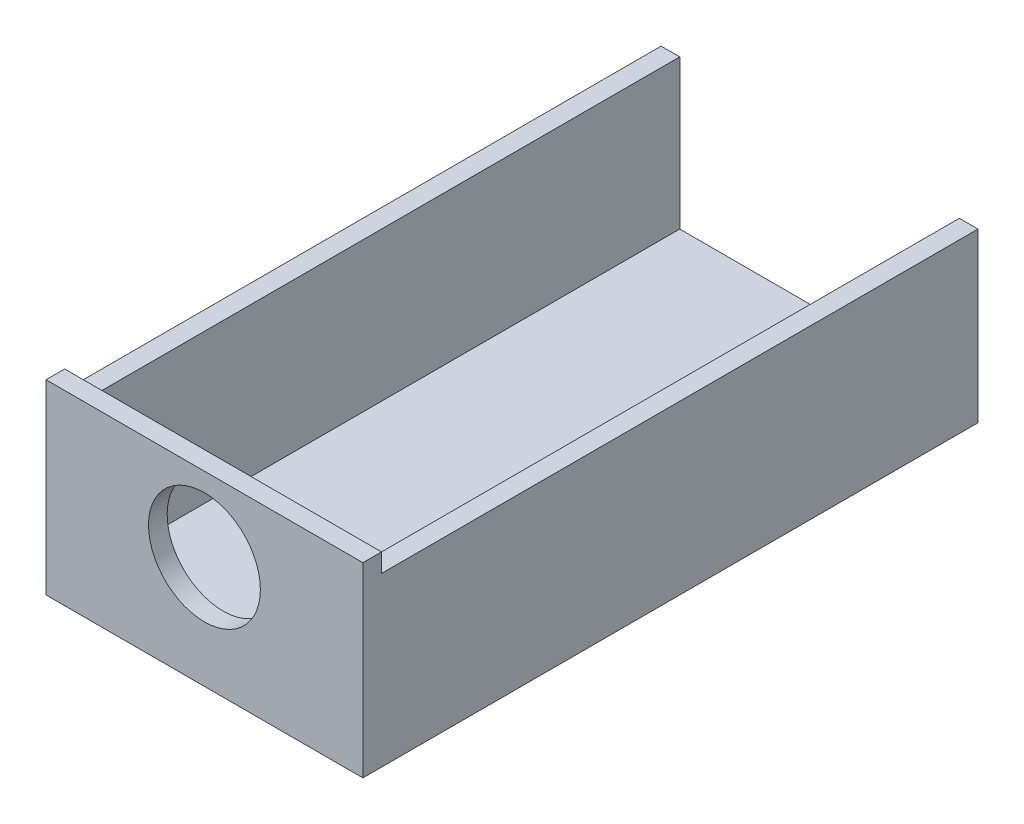
ISO-10303-21;
HEADER;
FILE_DESCRIPTION(('STEP AP214'),'2;1');
FILE_NAME('part.step','',(''),(''),'','','');
FILE_SCHEMA(('AUTOMOTIVE_DESIGN { 1 0 10303 214 1 1 1 1 }'));
ENDSEC;
DATA;
#1=APPLICATION_CONTEXT('core data for automotive mechanical design processes');
#2=APPLICATION_PROTOCOL_DEFINITION('international standard','automotive_design',2000,#1);
#3=PRODUCT_CONTEXT('',#1,'mechanical');
#4=PRODUCT('Part','Part','',(#3));
#5=PRODUCT_RELATED_PRODUCT_CATEGORY('part','',(#4));
#6=PRODUCT_DEFINITION_FORMATION('','',#4);
#7=PRODUCT_DEFINITION_CONTEXT('part definition',#1,'design');
#8=PRODUCT_DEFINITION('design','',#6,#7);
#9=PRODUCT_DEFINITION_SHAPE('','',#8);
#10=(LENGTH_UNIT() NAMED_UNIT(*) SI_UNIT(.MILLI.,.METRE.));
#11=(NAMED_UNIT(*) PLANE_ANGLE_UNIT() SI_UNIT($,.RADIAN.));
#12=(NAMED_UNIT(*) SI_UNIT($,.STERADIAN.) SOLID_ANGLE_UNIT());
#13=UNCERTAINTY_MEASURE_WITH_UNIT(LENGTH_MEASURE(1.E-05),#10,'distance_accuracy_value','');
#14=(GEOMETRIC_REPRESENTATION_CONTEXT(3) GLOBAL_UNCERTAINTY_ASSIGNED_CONTEXT((#13)) GLOBAL_UNIT_ASSIGNED_CONTEXT((#10,
#11,#12)) REPRESENTATION_CONTEXT('',''));
#15=CARTESIAN_POINT('',(0.,0.,0.));
#16=DIRECTION('',(0.,0.,1.));
#17=DIRECTION('',(1.,0.,0.));
#18=AXIS2_PLACEMENT_3D('',#15,#16,#17);
#19=CARTESIAN_POINT('',(-8.49999999999999,10.,16.5));
#20=DIRECTION('',(1.,0.,0.));
#21=DIRECTION('',(0.,0.,-1.));
#22=AXIS2_PLACEMENT_3D('',#19,#20,#21);
#23=PLANE('',#22);
#24=DIRECTION('',(0.,-1.,0.));
#25=VECTOR('',#24,1.);
#26=CARTESIAN_POINT('',(-8.49999999999999,17.,15.5));
#27=LINE('',#26,#25);
#28=CARTESIAN_POINT('',(-8.49999999999999,10.,15.5));
#29=VERTEX_POINT('',#28);
#30=CARTESIAN_POINT('',(-8.49999999999999,9.,15.5));
#31=VERTEX_POINT('',#30);
#32=EDGE_CURVE('E124',#29,#31,#27,.T.);
#33=ORIENTED_EDGE('',*,*,#32,.T.);
#34=DIRECTION('',(0.,0.,1.));
#35=VECTOR('',#34,1.);
#36=CARTESIAN_POINT('',(-8.49999999999999,9.,-16.5));
#37=LINE('',#36,#35);
#38=CARTESIAN_POINT('',(-8.49999999999999,9.,-16.5));
#39=VERTEX_POINT('',#38);
#40=EDGE_CURVE('E83',#39,#31,#37,.T.);
#41=ORIENTED_EDGE('',*,*,#40,.F.);
#42=DIRECTION('',(0.,-1.,0.));
#43=VECTOR('',#42,1.);
#44=CARTESIAN_POINT('',(-8.49999999999999,10.,-16.5));
#45=LINE('',#44,#43);
#46=CARTESIAN_POINT('',(-8.49999999999999,0.,-16.5));
#47=VERTEX_POINT('',#46);
#48=EDGE_CURVE('E75',#39,#47,#45,.T.);
#49=ORIENTED_EDGE('',*,*,#48,.T.);
#50=DIRECTION('',(0.,0.,1.));
#51=VECTOR('',#50,1.);
#52=CARTESIAN_POINT('',(-8.49999999999999,0.,16.5));
#53=LINE('',#52,#51);
#54=CARTESIAN_POINT('',(-8.49999999999999,0.,16.5));
#55=VERTEX_POINT('',#54);
#56=EDGE_CURVE('E80',#47,#55,#53,.T.);
#57=ORIENTED_EDGE('',*,*,#56,.T.);
#58=DIRECTION('',(0.,-1.,0.));
#59=VECTOR('',#58,1.);
#60=CARTESIAN_POINT('',(-8.49999999999999,10.,16.5));
#61=LINE('',#60,#59);
#62=CARTESIAN_POINT('',(-8.49999999999999,10.,16.5));
#63=VERTEX_POINT('',#62);
#64=EDGE_CURVE('E11',#63,#55,#61,.T.);
#65=ORIENTED_EDGE('',*,*,#64,.F.);
#66=DIRECTION('',(0.,0.,1.));
#67=VECTOR('',#66,1.);
#68=CARTESIAN_POINT('',(-8.49999999999999,10.,16.5));
#69=LINE('',#68,#67);
#70=EDGE_CURVE('E97',#29,#63,#69,.T.);
#71=ORIENTED_EDGE('',*,*,#70,.F.);
#72=EDGE_LOOP('',(#33,#41,#49,#57,#65,#71));
#73=FACE_BOUND('',#72,.T.);
#74=ADVANCED_FACE('F32',(#73),#23,.F.);
#75=CARTESIAN_POINT('',(8.50000000000001,10.,16.5));
#76=DIRECTION('',(-1.,0.,0.));
#77=DIRECTION('',(0.,0.,1.));
#78=AXIS2_PLACEMENT_3D('',#75,#76,#77);
#79=PLANE('',#78);
#80=DIRECTION('',(0.,-1.,0.));
#81=VECTOR('',#80,1.);
#82=CARTESIAN_POINT('',(8.50000000000001,17.,15.5));
#83=LINE('',#82,#81);
#84=CARTESIAN_POINT('',(8.50000000000001,10.,15.5));
#85=VERTEX_POINT('',#84);
#86=CARTESIAN_POINT('',(8.50000000000001,9.,15.5));
#87=VERTEX_POINT('',#86);
#88=EDGE_CURVE('E162',#85,#87,#83,.T.);
#89=ORIENTED_EDGE('',*,*,#88,.F.);
#90=DIRECTION('',(0.,0.,-1.));
#91=VECTOR('',#90,1.);
#92=CARTESIAN_POINT('',(8.50000000000001,10.,16.5));
#93=LINE('',#92,#91);
#94=CARTESIAN_POINT('',(8.50000000000001,10.,16.5));
#95=VERTEX_POINT('',#94);
#96=EDGE_CURVE('E87',#95,#85,#93,.T.);
#97=ORIENTED_EDGE('',*,*,#96,.F.);
#98=DIRECTION('',(0.,-1.,0.));
#99=VECTOR('',#98,1.);
#100=CARTESIAN_POINT('',(8.50000000000001,10.,16.5));
#101=LINE('',#100,#99);
#102=CARTESIAN_POINT('',(8.50000000000001,0.,16.5));
#103=VERTEX_POINT('',#102);
#104=EDGE_CURVE('E39',#95,#103,#101,.T.);
#105=ORIENTED_EDGE('',*,*,#104,.T.);
#106=DIRECTION('',(0.,0.,-1.));
#107=VECTOR('',#106,1.);
#108=CARTESIAN_POINT('',(8.50000000000001,0.,16.5));
#109=LINE('',#108,#107);
#110=CARTESIAN_POINT('',(8.50000000000001,0.,-16.5));
#111=VERTEX_POINT('',#110);
#112=EDGE_CURVE('E98',#103,#111,#109,.T.);
#113=ORIENTED_EDGE('',*,*,#112,.T.);
#114=DIRECTION('',(0.,-1.,0.));
#115=VECTOR('',#114,1.);
#116=CARTESIAN_POINT('',(8.50000000000001,10.,-16.5));
#117=LINE('',#116,#115);
#118=CARTESIAN_POINT('',(8.50000000000001,9.,-16.5));
#119=VERTEX_POINT('',#118);
#120=EDGE_CURVE('E86',#119,#111,#117,.T.);
#121=ORIENTED_EDGE('',*,*,#120,.F.);
#122=DIRECTION('',(0.,0.,-1.));
#123=VECTOR('',#122,1.);
#124=CARTESIAN_POINT('',(8.50000000000001,9.,-16.5));
#125=LINE('',#124,#123);
#126=EDGE_CURVE('E169',#87,#119,#125,.T.);
#127=ORIENTED_EDGE('',*,*,#126,.F.);
#128=EDGE_LOOP('',(#89,#97,#105,#113,#121,#127));
#129=FACE_BOUND('',#128,.T.);
#130=ADVANCED_FACE('F116',(#129),#79,.F.);
#131=CARTESIAN_POINT('',(8.50000000000001,10.,-16.5));
#132=DIRECTION('',(0.,0.,1.));
#133=DIRECTION('',(1.,0.,0.));
#134=AXIS2_PLACEMENT_3D('',#131,#132,#133);
#135=PLANE('',#134);
#136=DIRECTION('',(-1.,0.,0.));
#137=VECTOR('',#136,1.);
#138=CARTESIAN_POINT('',(-8.49999999999999,9.,-16.5));
#139=LINE('',#138,#137);
#140=CARTESIAN_POINT('',(7.50000000000001,9.,-16.5));
#141=VERTEX_POINT('',#140);
#142=EDGE_CURVE('E165',#119,#141,#139,.T.);
#143=ORIENTED_EDGE('',*,*,#142,.F.);
#144=ORIENTED_EDGE('',*,*,#120,.T.);
#145=DIRECTION('',(-1.,0.,0.));
#146=VECTOR('',#145,1.);
#147=CARTESIAN_POINT('',(8.50000000000001,0.,-16.5));
#148=LINE('',#147,#146);
#149=EDGE_CURVE('E90',#111,#47,#148,.T.);
#150=ORIENTED_EDGE('',*,*,#149,.T.);
#151=ORIENTED_EDGE('',*,*,#48,.F.);
#152=CARTESIAN_POINT('',(-7.5,9.,-16.5));
#153=VERTEX_POINT('',#152);
#154=EDGE_CURVE('E168',#153,#39,#139,.T.);
#155=ORIENTED_EDGE('',*,*,#154,.F.);
#156=DIRECTION('',(0.,-1.,0.));
#157=VECTOR('',#156,1.);
#158=CARTESIAN_POINT('',(-7.5,9.,-16.5));
#159=LINE('',#158,#157);
#160=CARTESIAN_POINT('',(-7.5,1.,-16.5));
#161=VERTEX_POINT('',#160);
#162=EDGE_CURVE('E134',#153,#161,#159,.T.);
#163=ORIENTED_EDGE('',*,*,#162,.T.);
#164=DIRECTION('',(-1.,0.,0.));
#165=VECTOR('',#164,1.);
#166=CARTESIAN_POINT('',(-7.5,1.,-16.5));
#167=LINE('',#166,#165);
#168=CARTESIAN_POINT('',(7.50000000000001,0.999999999999999,-16.5));
#169=VERTEX_POINT('',#168);
#170=EDGE_CURVE('E138',#169,#161,#167,.T.);
#171=ORIENTED_EDGE('',*,*,#170,.F.);
#172=DIRECTION('',(0.,-1.,0.));
#173=VECTOR('',#172,1.);
#174=CARTESIAN_POINT('',(7.50000000000001,9.,-16.5));
#175=LINE('',#174,#173);
#176=EDGE_CURVE('E46',#141,#169,#175,.T.);
#177=ORIENTED_EDGE('',*,*,#176,.F.);
#178=EDGE_LOOP('',(#143,#144,#150,#151,#155,#163,#171,#177));
#179=FACE_BOUND('',#178,.T.);
#180=ADVANCED_FACE('F92',(#179),#135,.F.);
#181=CARTESIAN_POINT('',(0.,10.,0.));
#182=DIRECTION('',(0.,1.,0.));
#183=DIRECTION('',(0.,0.,1.));
#184=AXIS2_PLACEMENT_3D('',#181,#182,#183);
#185=PLANE('',#184);
#186=ORIENTED_EDGE('',*,*,#96,.T.);
#187=DIRECTION('',(-1.,0.,0.));
#188=VECTOR('',#187,1.);
#189=CARTESIAN_POINT('',(0.,10.,15.5));
#190=LINE('',#189,#188);
#191=EDGE_CURVE('E159',#85,#29,#190,.T.);
#192=ORIENTED_EDGE('',*,*,#191,.T.);
#193=ORIENTED_EDGE('',*,*,#70,.T.);
#194=DIRECTION('',(1.,0.,0.));
#195=VECTOR('',#194,1.);
#196=CARTESIAN_POINT('',(8.50000000000001,10.,16.5));
#197=LINE('',#196,#195);
#198=EDGE_CURVE('E55',#63,#95,#197,.T.);
#199=ORIENTED_EDGE('',*,*,#198,.T.);
#200=EDGE_LOOP('',(#186,#192,#193,#199));
#201=FACE_BOUND('',#200,.T.);
#202=ADVANCED_FACE('F237',(#201),#185,.T.);
#203=CARTESIAN_POINT('',(8.50000000000001,10.,16.5));
#204=DIRECTION('',(0.,0.,-1.));
#205=DIRECTION('',(-1.,0.,0.));
#206=AXIS2_PLACEMENT_3D('',#203,#204,#205);
#207=PLANE('',#206);
#208=DIRECTION('',(1.,0.,0.));
#209=VECTOR('',#208,1.);
#210=CARTESIAN_POINT('',(8.50000000000001,0.,16.5));
#211=LINE('',#210,#209);
#212=EDGE_CURVE('E101',#55,#103,#211,.T.);
#213=ORIENTED_EDGE('',*,*,#212,.T.);
#214=ORIENTED_EDGE('',*,*,#104,.F.);
#215=ORIENTED_EDGE('',*,*,#198,.F.);
#216=ORIENTED_EDGE('',*,*,#64,.T.);
#217=EDGE_LOOP('',(#213,#214,#215,#216));
#218=FACE_BOUND('',#217,.T.);
#219=CARTESIAN_POINT('',(0.,6.,16.5));
#220=DIRECTION('',(0.,0.,1.));
#221=DIRECTION('',(1.,0.,0.));
#222=AXIS2_PLACEMENT_3D('',#219,#220,#221);
#223=CIRCLE('',#222,3.);
#224=CARTESIAN_POINT('',(3.,6.,16.5));
#225=VERTEX_POINT('',#224);
#226=EDGE_CURVE('E156',#225,#225,#223,.T.);
#227=ORIENTED_EDGE('',*,*,#226,.F.);
#228=EDGE_LOOP('',(#227));
#229=FACE_BOUND('',#228,.T.);
#230=ADVANCED_FACE('F118',(#218,#229),#207,.F.);
#231=CARTESIAN_POINT('',(-7.49999999999999,9.,15.5));
#232=DIRECTION('',(0.,0.,-1.));
#233=DIRECTION('',(-1.,0.,0.));
#234=AXIS2_PLACEMENT_3D('',#231,#232,#233);
#235=PLANE('',#234);
#236=CARTESIAN_POINT('',(0.,6.,15.5));
#237=DIRECTION('',(0.,0.,-1.));
#238=DIRECTION('',(-1.,0.,0.));
#239=AXIS2_PLACEMENT_3D('',#236,#237,#238);
#240=CIRCLE('',#239,3.);
#241=CARTESIAN_POINT('',(-3.,6.,15.5));
#242=VERTEX_POINT('',#241);
#243=EDGE_CURVE('E150',#242,#242,#240,.F.);
#244=ORIENTED_EDGE('',*,*,#243,.T.);
#245=EDGE_LOOP('',(#244));
#246=FACE_BOUND('',#245,.T.);
#247=DIRECTION('',(0.,-1.,0.));
#248=VECTOR('',#247,1.);
#249=CARTESIAN_POINT('',(-7.49999999999999,9.,15.5));
#250=LINE('',#249,#248);
#251=CARTESIAN_POINT('',(-7.5,9.,15.5));
#252=VERTEX_POINT('',#251);
#253=CARTESIAN_POINT('',(-7.49999999999999,1.,15.5));
#254=VERTEX_POINT('',#253);
#255=EDGE_CURVE('E102',#252,#254,#250,.T.);
#256=ORIENTED_EDGE('',*,*,#255,.F.);
#257=DIRECTION('',(1.,0.,0.));
#258=VECTOR('',#257,1.);
#259=CARTESIAN_POINT('',(-8.49999999999999,9.,15.5));
#260=LINE('',#259,#258);
#261=EDGE_CURVE('E172',#31,#252,#260,.T.);
#262=ORIENTED_EDGE('',*,*,#261,.F.);
#263=ORIENTED_EDGE('',*,*,#32,.F.);
#264=ORIENTED_EDGE('',*,*,#191,.F.);
#265=ORIENTED_EDGE('',*,*,#88,.T.);
#266=CARTESIAN_POINT('',(7.50000000000001,9.,15.5));
#267=VERTEX_POINT('',#266);
#268=EDGE_CURVE('E175',#267,#87,#260,.T.);
#269=ORIENTED_EDGE('',*,*,#268,.F.);
#270=DIRECTION('',(0.,-1.,0.));
#271=VECTOR('',#270,1.);
#272=CARTESIAN_POINT('',(7.50000000000001,9.,15.5));
#273=LINE('',#272,#271);
#274=CARTESIAN_POINT('',(7.50000000000001,1.,15.5));
#275=VERTEX_POINT('',#274);
#276=EDGE_CURVE('E106',#267,#275,#273,.T.);
#277=ORIENTED_EDGE('',*,*,#276,.T.);
#278=DIRECTION('',(1.,0.,0.));
#279=VECTOR('',#278,1.);
#280=CARTESIAN_POINT('',(-7.49999999999999,1.,15.5));
#281=LINE('',#280,#279);
#282=EDGE_CURVE('E144',#254,#275,#281,.T.);
#283=ORIENTED_EDGE('',*,*,#282,.F.);
#284=EDGE_LOOP('',(#256,#262,#263,#264,#265,#269,#277,#283));
#285=FACE_BOUND('',#284,.T.);
#286=ADVANCED_FACE('F217',(#246,#285),#235,.T.);
#287=CARTESIAN_POINT('',(0.,0.,0.));
#288=DIRECTION('',(0.,1.,0.));
#289=DIRECTION('',(0.,0.,1.));
#290=AXIS2_PLACEMENT_3D('',#287,#288,#289);
#291=PLANE('',#290);
#292=ORIENTED_EDGE('',*,*,#56,.F.);
#293=ORIENTED_EDGE('',*,*,#149,.F.);
#294=ORIENTED_EDGE('',*,*,#112,.F.);
#295=ORIENTED_EDGE('',*,*,#212,.F.);
#296=EDGE_LOOP('',(#292,#293,#294,#295));
#297=FACE_BOUND('',#296,.T.);
#298=ADVANCED_FACE('F100',(#297),#291,.F.);
#299=CARTESIAN_POINT('',(-7.5,9.,-16.5));
#300=DIRECTION('',(1.,0.,0.));
#301=DIRECTION('',(0.,0.,-1.));
#302=AXIS2_PLACEMENT_3D('',#299,#300,#301);
#303=PLANE('',#302);
#304=DIRECTION('',(0.,0.,1.));
#305=VECTOR('',#304,1.);
#306=CARTESIAN_POINT('',(-7.5,1.,-16.5));
#307=LINE('',#306,#305);
#308=EDGE_CURVE('E147',#161,#254,#307,.T.);
#309=ORIENTED_EDGE('',*,*,#308,.F.);
#310=ORIENTED_EDGE('',*,*,#162,.F.);
#311=DIRECTION('',(0.,0.,1.));
#312=VECTOR('',#311,1.);
#313=CARTESIAN_POINT('',(-7.5,9.,-16.5));
#314=LINE('',#313,#312);
#315=EDGE_CURVE('E141',#153,#252,#314,.T.);
#316=ORIENTED_EDGE('',*,*,#315,.T.);
#317=ORIENTED_EDGE('',*,*,#255,.T.);
#318=EDGE_LOOP('',(#309,#310,#316,#317));
#319=FACE_BOUND('',#318,.T.);
#320=ADVANCED_FACE('F213',(#319),#303,.T.);
#321=CARTESIAN_POINT('',(7.50000000000001,9.,-16.5));
#322=DIRECTION('',(-1.,0.,0.));
#323=DIRECTION('',(0.,0.,1.));
#324=AXIS2_PLACEMENT_3D('',#321,#322,#323);
#325=PLANE('',#324);
#326=DIRECTION('',(0.,0.,-1.));
#327=VECTOR('',#326,1.);
#328=CARTESIAN_POINT('',(7.50000000000001,1.,-16.5));
#329=LINE('',#328,#327);
#330=EDGE_CURVE('E142',#275,#169,#329,.T.);
#331=ORIENTED_EDGE('',*,*,#330,.F.);
#332=ORIENTED_EDGE('',*,*,#276,.F.);
#333=DIRECTION('',(0.,0.,-1.));
#334=VECTOR('',#333,1.);
#335=CARTESIAN_POINT('',(7.50000000000001,9.,-16.5));
#336=LINE('',#335,#334);
#337=EDGE_CURVE('E137',#267,#141,#336,.T.);
#338=ORIENTED_EDGE('',*,*,#337,.T.);
#339=ORIENTED_EDGE('',*,*,#176,.T.);
#340=EDGE_LOOP('',(#331,#332,#338,#339));
#341=FACE_BOUND('',#340,.T.);
#342=ADVANCED_FACE('F218',(#341),#325,.T.);
#343=CARTESIAN_POINT('',(0.,1.,0.));
#344=DIRECTION('',(0.,1.,0.));
#345=DIRECTION('',(0.,0.,1.));
#346=AXIS2_PLACEMENT_3D('',#343,#344,#345);
#347=PLANE('',#346);
#348=ORIENTED_EDGE('',*,*,#308,.T.);
#349=ORIENTED_EDGE('',*,*,#282,.T.);
#350=ORIENTED_EDGE('',*,*,#330,.T.);
#351=ORIENTED_EDGE('',*,*,#170,.T.);
#352=EDGE_LOOP('',(#348,#349,#350,#351));
#353=FACE_BOUND('',#352,.T.);
#354=ADVANCED_FACE('F210',(#353),#347,.T.);
#355=CARTESIAN_POINT('',(0.,6.,16.5));
#356=DIRECTION('',(0.,0.,-1.));
#357=DIRECTION('',(-1.,0.,0.));
#358=AXIS2_PLACEMENT_3D('',#355,#356,#357);
#359=CYLINDRICAL_SURFACE('',#358,3.);
#360=ORIENTED_EDGE('',*,*,#243,.F.);
#361=EDGE_LOOP('',(#360));
#362=FACE_BOUND('',#361,.T.);
#363=ORIENTED_EDGE('',*,*,#226,.T.);
#364=EDGE_LOOP('',(#363));
#365=FACE_BOUND('',#364,.T.);
#366=ADVANCED_FACE('F225',(#362,#365),#359,.F.);
#367=CARTESIAN_POINT('',(0.,9.,0.));
#368=DIRECTION('',(0.,1.,0.));
#369=DIRECTION('',(0.,0.,1.));
#370=AXIS2_PLACEMENT_3D('',#367,#368,#369);
#371=PLANE('',#370);
#372=ORIENTED_EDGE('',*,*,#154,.T.);
#373=ORIENTED_EDGE('',*,*,#40,.T.);
#374=ORIENTED_EDGE('',*,*,#261,.T.);
#375=ORIENTED_EDGE('',*,*,#315,.F.);
#376=EDGE_LOOP('',(#372,#373,#374,#375));
#377=FACE_BOUND('',#376,.T.);
#378=ADVANCED_FACE('F215',(#377),#371,.T.);
#379=ORIENTED_EDGE('',*,*,#268,.T.);
#380=ORIENTED_EDGE('',*,*,#126,.T.);
#381=ORIENTED_EDGE('',*,*,#142,.T.);
#382=ORIENTED_EDGE('',*,*,#337,.F.);
#383=EDGE_LOOP('',(#379,#380,#381,#382));
#384=FACE_BOUND('',#383,.T.);
#385=ADVANCED_FACE('F184',(#384),#371,.T.);
#386=CLOSED_SHELL('',(#74,#130,#180,#202,#230,#286,#298,#320,#342,#354,#366,#378,#385));
#387=MANIFOLD_SOLID_BREP('B2',#386);
#388=ADVANCED_BREP_SHAPE_REPRESENTATION('',(#18,#387),#14);
#389=SHAPE_DEFINITION_REPRESENTATION(#9,#388);
ENDSEC;
END-ISO-10303-21;
